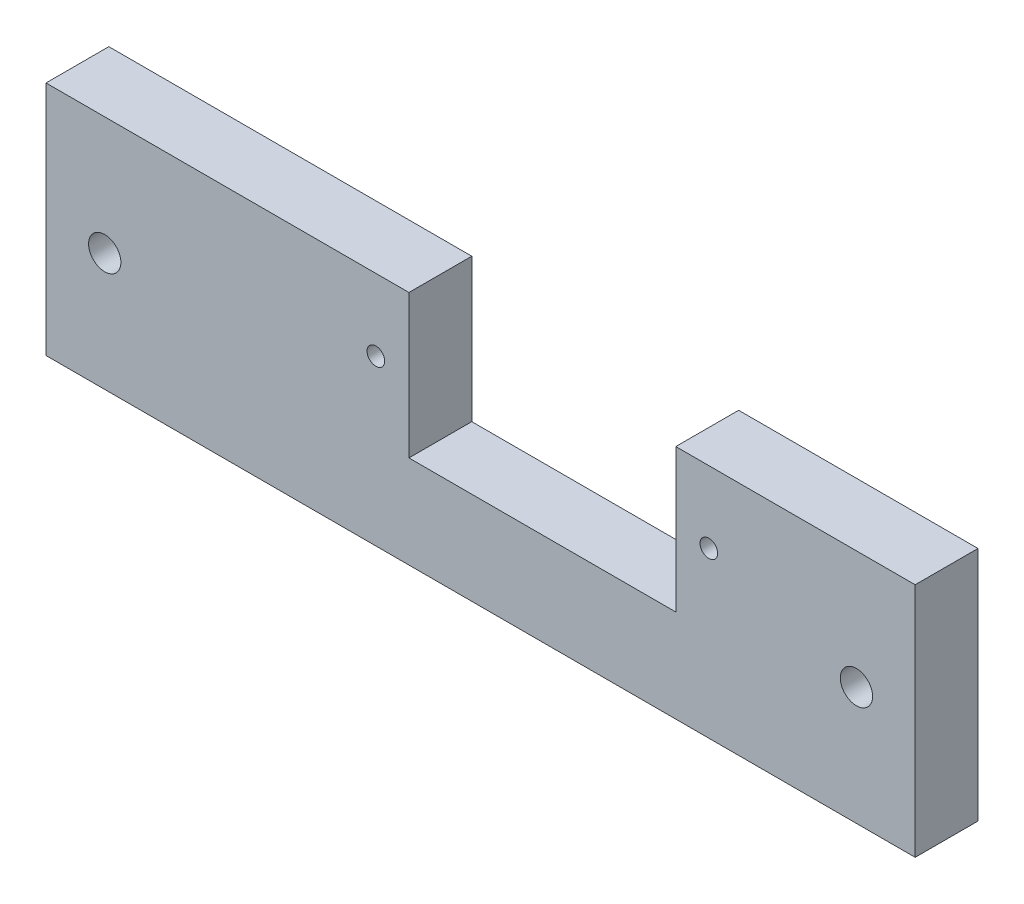
ISO-10303-21;
HEADER;
FILE_DESCRIPTION(('STEP AP214'),'2;1');
FILE_NAME('part.step','',(''),(''),'','','');
FILE_SCHEMA(('AUTOMOTIVE_DESIGN { 1 0 10303 214 1 1 1 1 }'));
ENDSEC;
DATA;
#1=APPLICATION_CONTEXT('core data for automotive mechanical design processes');
#2=APPLICATION_PROTOCOL_DEFINITION('international standard','automotive_design',2000,#1);
#3=PRODUCT_CONTEXT('',#1,'mechanical');
#4=PRODUCT('Part','Part','',(#3));
#5=PRODUCT_RELATED_PRODUCT_CATEGORY('part','',(#4));
#6=PRODUCT_DEFINITION_FORMATION('','',#4);
#7=PRODUCT_DEFINITION_CONTEXT('part definition',#1,'design');
#8=PRODUCT_DEFINITION('design','',#6,#7);
#9=PRODUCT_DEFINITION_SHAPE('','',#8);
#10=(LENGTH_UNIT() NAMED_UNIT(*) SI_UNIT(.MILLI.,.METRE.));
#11=(NAMED_UNIT(*) PLANE_ANGLE_UNIT() SI_UNIT($,.RADIAN.));
#12=(NAMED_UNIT(*) SI_UNIT($,.STERADIAN.) SOLID_ANGLE_UNIT());
#13=UNCERTAINTY_MEASURE_WITH_UNIT(LENGTH_MEASURE(1.E-05),#10,'distance_accuracy_value','');
#14=(GEOMETRIC_REPRESENTATION_CONTEXT(3) GLOBAL_UNCERTAINTY_ASSIGNED_CONTEXT((#13)) GLOBAL_UNIT_ASSIGNED_CONTEXT((#10,
#11,#12)) REPRESENTATION_CONTEXT('',''));
#15=CARTESIAN_POINT('',(0.,0.,0.));
#16=DIRECTION('',(0.,0.,1.));
#17=DIRECTION('',(1.,0.,0.));
#18=AXIS2_PLACEMENT_3D('',#15,#16,#17);
#19=CARTESIAN_POINT('',(0.,20.0999993831,5.35));
#20=DIRECTION('',(0.,1.,0.));
#21=DIRECTION('',(0.,0.,1.));
#22=AXIS2_PLACEMENT_3D('',#19,#20,#21);
#23=PLANE('',#22);
#24=DIRECTION('',(1.,0.,0.));
#25=VECTOR('',#24,1.);
#26=CARTESIAN_POINT('',(0.,20.0999993831,0.));
#27=LINE('',#26,#25);
#28=CARTESIAN_POINT('',(53.6200013011,20.0999993831,0.));
#29=VERTEX_POINT('',#28);
#30=CARTESIAN_POINT('',(74.0000009536,20.0999993831,0.));
#31=VERTEX_POINT('',#30);
#32=EDGE_CURVE('E141',#29,#31,#27,.T.);
#33=ORIENTED_EDGE('',*,*,#32,.F.);
#34=DIRECTION('',(0.,0.,-1.));
#35=VECTOR('',#34,1.);
#36=CARTESIAN_POINT('',(53.6200013011,20.0999993831,5.35));
#37=LINE('',#36,#35);
#38=CARTESIAN_POINT('',(53.6200013011,20.0999993831,5.35));
#39=VERTEX_POINT('',#38);
#40=EDGE_CURVE('E11',#39,#29,#37,.T.);
#41=ORIENTED_EDGE('',*,*,#40,.F.);
#42=DIRECTION('',(1.,0.,0.));
#43=VECTOR('',#42,1.);
#44=CARTESIAN_POINT('',(0.,20.0999993831,5.35));
#45=LINE('',#44,#43);
#46=CARTESIAN_POINT('',(74.0000009536,20.0999993831,5.35));
#47=VERTEX_POINT('',#46);
#48=EDGE_CURVE('E190',#39,#47,#45,.T.);
#49=ORIENTED_EDGE('',*,*,#48,.T.);
#50=DIRECTION('',(0.,0.,-1.));
#51=VECTOR('',#50,1.);
#52=CARTESIAN_POINT('',(74.0000009536,20.0999993831,5.35));
#53=LINE('',#52,#51);
#54=EDGE_CURVE('E52',#47,#31,#53,.T.);
#55=ORIENTED_EDGE('',*,*,#54,.T.);
#56=EDGE_LOOP('',(#33,#41,#49,#55));
#57=FACE_BOUND('',#56,.T.);
#58=ADVANCED_FACE('F35',(#57),#23,.T.);
#59=CARTESIAN_POINT('',(53.6200013011,0.,5.35));
#60=DIRECTION('',(-1.,0.,0.));
#61=DIRECTION('',(0.,0.,1.));
#62=AXIS2_PLACEMENT_3D('',#59,#60,#61);
#63=PLANE('',#62);
#64=DIRECTION('',(0.,1.,0.));
#65=VECTOR('',#64,1.);
#66=CARTESIAN_POINT('',(53.6200013011,0.,0.));
#67=LINE('',#66,#65);
#68=CARTESIAN_POINT('',(53.6200013011,7.8999996185,0.));
#69=VERTEX_POINT('',#68);
#70=EDGE_CURVE('E143',#69,#29,#67,.T.);
#71=ORIENTED_EDGE('',*,*,#70,.F.);
#72=DIRECTION('',(0.,0.,-1.));
#73=VECTOR('',#72,1.);
#74=CARTESIAN_POINT('',(53.6200013011,7.8999996185,5.35));
#75=LINE('',#74,#73);
#76=CARTESIAN_POINT('',(53.6200013011,7.8999996185,5.35));
#77=VERTEX_POINT('',#76);
#78=EDGE_CURVE('E44',#77,#69,#75,.T.);
#79=ORIENTED_EDGE('',*,*,#78,.F.);
#80=DIRECTION('',(0.,1.,0.));
#81=VECTOR('',#80,1.);
#82=CARTESIAN_POINT('',(53.6200013011,0.,5.35));
#83=LINE('',#82,#81);
#84=EDGE_CURVE('E187',#77,#39,#83,.T.);
#85=ORIENTED_EDGE('',*,*,#84,.T.);
#86=ORIENTED_EDGE('',*,*,#40,.T.);
#87=EDGE_LOOP('',(#71,#79,#85,#86));
#88=FACE_BOUND('',#87,.T.);
#89=ADVANCED_FACE('F178',(#88),#63,.T.);
#90=CARTESIAN_POINT('',(0.,7.8999996185,5.35));
#91=DIRECTION('',(0.,1.,0.));
#92=DIRECTION('',(0.,0.,1.));
#93=AXIS2_PLACEMENT_3D('',#90,#91,#92);
#94=PLANE('',#93);
#95=DIRECTION('',(1.,0.,0.));
#96=VECTOR('',#95,1.);
#97=CARTESIAN_POINT('',(0.,7.8999996185,0.));
#98=LINE('',#97,#96);
#99=CARTESIAN_POINT('',(30.9000005945,7.8999996185,0.));
#100=VERTEX_POINT('',#99);
#101=EDGE_CURVE('E146',#100,#69,#98,.T.);
#102=ORIENTED_EDGE('',*,*,#101,.F.);
#103=DIRECTION('',(0.,0.,-1.));
#104=VECTOR('',#103,1.);
#105=CARTESIAN_POINT('',(30.9000005945,7.8999996185,5.35));
#106=LINE('',#105,#104);
#107=CARTESIAN_POINT('',(30.9000005945,7.8999996185,5.35));
#108=VERTEX_POINT('',#107);
#109=EDGE_CURVE('E167',#108,#100,#106,.T.);
#110=ORIENTED_EDGE('',*,*,#109,.F.);
#111=DIRECTION('',(1.,0.,0.));
#112=VECTOR('',#111,1.);
#113=CARTESIAN_POINT('',(0.,7.8999996185,5.35));
#114=LINE('',#113,#112);
#115=EDGE_CURVE('E174',#108,#77,#114,.T.);
#116=ORIENTED_EDGE('',*,*,#115,.T.);
#117=ORIENTED_EDGE('',*,*,#78,.T.);
#118=EDGE_LOOP('',(#102,#110,#116,#117));
#119=FACE_BOUND('',#118,.T.);
#120=ADVANCED_FACE('F172',(#119),#94,.T.);
#121=CARTESIAN_POINT('',(30.9000005945,0.,5.35));
#122=DIRECTION('',(1.,0.,0.));
#123=DIRECTION('',(0.,0.,-1.));
#124=AXIS2_PLACEMENT_3D('',#121,#122,#123);
#125=PLANE('',#124);
#126=DIRECTION('',(0.,-1.,0.));
#127=VECTOR('',#126,1.);
#128=CARTESIAN_POINT('',(30.9000005945,0.,0.));
#129=LINE('',#128,#127);
#130=CARTESIAN_POINT('',(30.9000005945,20.0999993831,0.));
#131=VERTEX_POINT('',#130);
#132=EDGE_CURVE('E149',#131,#100,#129,.T.);
#133=ORIENTED_EDGE('',*,*,#132,.F.);
#134=DIRECTION('',(0.,0.,-1.));
#135=VECTOR('',#134,1.);
#136=CARTESIAN_POINT('',(30.9000005945,20.0999993831,5.35));
#137=LINE('',#136,#135);
#138=CARTESIAN_POINT('',(30.9000005945,20.0999993831,5.35));
#139=VERTEX_POINT('',#138);
#140=EDGE_CURVE('E165',#139,#131,#137,.T.);
#141=ORIENTED_EDGE('',*,*,#140,.F.);
#142=DIRECTION('',(0.,-1.,0.));
#143=VECTOR('',#142,1.);
#144=CARTESIAN_POINT('',(30.9000005945,0.,5.35));
#145=LINE('',#144,#143);
#146=EDGE_CURVE('E186',#139,#108,#145,.T.);
#147=ORIENTED_EDGE('',*,*,#146,.T.);
#148=ORIENTED_EDGE('',*,*,#109,.T.);
#149=EDGE_LOOP('',(#133,#141,#147,#148));
#150=FACE_BOUND('',#149,.T.);
#151=ADVANCED_FACE('F184',(#150),#125,.T.);
#152=CARTESIAN_POINT('',(0.,20.0999993831,5.35));
#153=DIRECTION('',(0.,1.,0.));
#154=DIRECTION('',(0.,0.,1.));
#155=AXIS2_PLACEMENT_3D('',#152,#153,#154);
#156=PLANE('',#155);
#157=DIRECTION('',(1.,0.,0.));
#158=VECTOR('',#157,1.);
#159=CARTESIAN_POINT('',(0.,20.0999993831,0.));
#160=LINE('',#159,#158);
#161=CARTESIAN_POINT('',(0.,20.0999993831,0.));
#162=VERTEX_POINT('',#161);
#163=EDGE_CURVE('E152',#162,#131,#160,.T.);
#164=ORIENTED_EDGE('',*,*,#163,.F.);
#165=DIRECTION('',(0.,0.,-1.));
#166=VECTOR('',#165,1.);
#167=CARTESIAN_POINT('',(0.,20.0999993831,5.35));
#168=LINE('',#167,#166);
#169=CARTESIAN_POINT('',(0.,20.0999993831,5.35));
#170=VERTEX_POINT('',#169);
#171=EDGE_CURVE('E111',#170,#162,#168,.T.);
#172=ORIENTED_EDGE('',*,*,#171,.F.);
#173=DIRECTION('',(1.,0.,0.));
#174=VECTOR('',#173,1.);
#175=CARTESIAN_POINT('',(0.,20.0999993831,5.35));
#176=LINE('',#175,#174);
#177=EDGE_CURVE('E121',#170,#139,#176,.T.);
#178=ORIENTED_EDGE('',*,*,#177,.T.);
#179=ORIENTED_EDGE('',*,*,#140,.T.);
#180=EDGE_LOOP('',(#164,#172,#178,#179));
#181=FACE_BOUND('',#180,.T.);
#182=ADVANCED_FACE('F194',(#181),#156,.T.);
#183=CARTESIAN_POINT('',(0.,0.,5.35));
#184=DIRECTION('',(-1.,0.,0.));
#185=DIRECTION('',(0.,0.,1.));
#186=AXIS2_PLACEMENT_3D('',#183,#184,#185);
#187=PLANE('',#186);
#188=DIRECTION('',(0.,1.,0.));
#189=VECTOR('',#188,1.);
#190=CARTESIAN_POINT('',(0.,0.,0.));
#191=LINE('',#190,#189);
#192=CARTESIAN_POINT('',(0.,0.,0.));
#193=VERTEX_POINT('',#192);
#194=EDGE_CURVE('E107',#193,#162,#191,.T.);
#195=ORIENTED_EDGE('',*,*,#194,.F.);
#196=DIRECTION('',(0.,0.,-1.));
#197=VECTOR('',#196,1.);
#198=CARTESIAN_POINT('',(0.,0.,5.35));
#199=LINE('',#198,#197);
#200=CARTESIAN_POINT('',(0.,0.,5.35));
#201=VERTEX_POINT('',#200);
#202=EDGE_CURVE('E102',#201,#193,#199,.T.);
#203=ORIENTED_EDGE('',*,*,#202,.F.);
#204=DIRECTION('',(0.,1.,0.));
#205=VECTOR('',#204,1.);
#206=CARTESIAN_POINT('',(0.,0.,5.35));
#207=LINE('',#206,#205);
#208=EDGE_CURVE('E105',#201,#170,#207,.T.);
#209=ORIENTED_EDGE('',*,*,#208,.T.);
#210=ORIENTED_EDGE('',*,*,#171,.T.);
#211=EDGE_LOOP('',(#195,#203,#209,#210));
#212=FACE_BOUND('',#211,.T.);
#213=ADVANCED_FACE('F104',(#212),#187,.T.);
#214=CARTESIAN_POINT('',(0.,0.,5.35));
#215=DIRECTION('',(0.,-1.,0.));
#216=DIRECTION('',(0.,0.,-1.));
#217=AXIS2_PLACEMENT_3D('',#214,#215,#216);
#218=PLANE('',#217);
#219=DIRECTION('',(-1.,0.,0.));
#220=VECTOR('',#219,1.);
#221=CARTESIAN_POINT('',(0.,0.,0.));
#222=LINE('',#221,#220);
#223=CARTESIAN_POINT('',(74.0000009536,0.,0.));
#224=VERTEX_POINT('',#223);
#225=EDGE_CURVE('E156',#224,#193,#222,.T.);
#226=ORIENTED_EDGE('',*,*,#225,.F.);
#227=DIRECTION('',(0.,0.,-1.));
#228=VECTOR('',#227,1.);
#229=CARTESIAN_POINT('',(74.0000009536,0.,5.35));
#230=LINE('',#229,#228);
#231=CARTESIAN_POINT('',(74.0000009536,0.,5.35));
#232=VERTEX_POINT('',#231);
#233=EDGE_CURVE('E77',#232,#224,#230,.T.);
#234=ORIENTED_EDGE('',*,*,#233,.F.);
#235=DIRECTION('',(-1.,0.,0.));
#236=VECTOR('',#235,1.);
#237=CARTESIAN_POINT('',(0.,0.,5.35));
#238=LINE('',#237,#236);
#239=EDGE_CURVE('E118',#232,#201,#238,.T.);
#240=ORIENTED_EDGE('',*,*,#239,.T.);
#241=ORIENTED_EDGE('',*,*,#202,.T.);
#242=EDGE_LOOP('',(#226,#234,#240,#241));
#243=FACE_BOUND('',#242,.T.);
#244=ADVANCED_FACE('F123',(#243),#218,.T.);
#245=CARTESIAN_POINT('',(69.0000004768,10.0499996916,5.35));
#246=DIRECTION('',(0.,0.,-1.));
#247=DIRECTION('',(-1.,0.,0.));
#248=AXIS2_PLACEMENT_3D('',#245,#246,#247);
#249=CYLINDRICAL_SURFACE('',#248,1.37499999999999);
#250=CARTESIAN_POINT('',(69.0000004768,10.0499996916,5.35));
#251=DIRECTION('',(0.,0.,1.));
#252=DIRECTION('',(1.,0.,0.));
#253=AXIS2_PLACEMENT_3D('',#250,#251,#252);
#254=CIRCLE('',#253,1.37499999999999);
#255=CARTESIAN_POINT('',(70.3750004768,10.0499996916,5.35));
#256=VERTEX_POINT('',#255);
#257=EDGE_CURVE('E333',#256,#256,#254,.T.);
#258=ORIENTED_EDGE('',*,*,#257,.T.);
#259=EDGE_LOOP('',(#258));
#260=FACE_BOUND('',#259,.T.);
#261=CARTESIAN_POINT('',(69.0000004768,10.0499996916,0.));
#262=DIRECTION('',(0.,0.,1.));
#263=DIRECTION('',(1.,0.,0.));
#264=AXIS2_PLACEMENT_3D('',#261,#262,#263);
#265=CIRCLE('',#264,1.37499999999999);
#266=CARTESIAN_POINT('',(70.3750004768,10.0499996916,0.));
#267=VERTEX_POINT('',#266);
#268=EDGE_CURVE('E138',#267,#267,#265,.T.);
#269=ORIENTED_EDGE('',*,*,#268,.F.);
#270=EDGE_LOOP('',(#269));
#271=FACE_BOUND('',#270,.T.);
#272=ADVANCED_FACE('F216',(#260,#271),#249,.F.);
#273=CARTESIAN_POINT('',(5.00000047679999,10.0499996916,5.35));
#274=DIRECTION('',(0.,0.,-1.));
#275=DIRECTION('',(-1.,0.,0.));
#276=AXIS2_PLACEMENT_3D('',#273,#274,#275);
#277=CYLINDRICAL_SURFACE('',#276,1.375);
#278=CARTESIAN_POINT('',(5.00000047679999,10.0499996916,5.35));
#279=DIRECTION('',(0.,0.,1.));
#280=DIRECTION('',(1.,0.,0.));
#281=AXIS2_PLACEMENT_3D('',#278,#279,#280);
#282=CIRCLE('',#281,1.375);
#283=CARTESIAN_POINT('',(6.37500047679999,10.0499996916,5.35));
#284=VERTEX_POINT('',#283);
#285=EDGE_CURVE('E330',#284,#284,#282,.T.);
#286=ORIENTED_EDGE('',*,*,#285,.T.);
#287=EDGE_LOOP('',(#286));
#288=FACE_BOUND('',#287,.T.);
#289=CARTESIAN_POINT('',(5.00000047679999,10.0499996916,0.));
#290=DIRECTION('',(0.,0.,1.));
#291=DIRECTION('',(1.,0.,0.));
#292=AXIS2_PLACEMENT_3D('',#289,#290,#291);
#293=CIRCLE('',#292,1.375);
#294=CARTESIAN_POINT('',(6.37500047679999,10.0499996916,0.));
#295=VERTEX_POINT('',#294);
#296=EDGE_CURVE('E135',#295,#295,#293,.T.);
#297=ORIENTED_EDGE('',*,*,#296,.F.);
#298=EDGE_LOOP('',(#297));
#299=FACE_BOUND('',#298,.T.);
#300=ADVANCED_FACE('F219',(#288,#299),#277,.F.);
#301=CARTESIAN_POINT('',(56.4336756398,13.9999996915,5.35));
#302=DIRECTION('',(0.,0.,-1.));
#303=DIRECTION('',(-1.,0.,0.));
#304=AXIS2_PLACEMENT_3D('',#301,#302,#303);
#305=CYLINDRICAL_SURFACE('',#304,0.749999999999999);
#306=CARTESIAN_POINT('',(56.4336756398,13.9999996915,5.35));
#307=DIRECTION('',(0.,0.,1.));
#308=DIRECTION('',(1.,0.,0.));
#309=AXIS2_PLACEMENT_3D('',#306,#307,#308);
#310=CIRCLE('',#309,0.749999999999999);
#311=CARTESIAN_POINT('',(57.1836756398,13.9999996915,5.35));
#312=VERTEX_POINT('',#311);
#313=EDGE_CURVE('E230',#312,#312,#310,.T.);
#314=ORIENTED_EDGE('',*,*,#313,.T.);
#315=EDGE_LOOP('',(#314));
#316=FACE_BOUND('',#315,.T.);
#317=CARTESIAN_POINT('',(56.4336756398,13.9999996915,0.));
#318=DIRECTION('',(0.,0.,1.));
#319=DIRECTION('',(1.,0.,0.));
#320=AXIS2_PLACEMENT_3D('',#317,#318,#319);
#321=CIRCLE('',#320,0.749999999999999);
#322=CARTESIAN_POINT('',(57.1836756398,13.9999996915,0.));
#323=VERTEX_POINT('',#322);
#324=EDGE_CURVE('E132',#323,#323,#321,.T.);
#325=ORIENTED_EDGE('',*,*,#324,.F.);
#326=EDGE_LOOP('',(#325));
#327=FACE_BOUND('',#326,.T.);
#328=ADVANCED_FACE('F204',(#316,#327),#305,.F.);
#329=CARTESIAN_POINT('',(28.0863253138,13.9999996915,5.35));
#330=DIRECTION('',(0.,0.,-1.));
#331=DIRECTION('',(-1.,0.,0.));
#332=AXIS2_PLACEMENT_3D('',#329,#330,#331);
#333=CYLINDRICAL_SURFACE('',#332,0.749999999999987);
#334=CARTESIAN_POINT('',(28.0863253138,13.9999996915,5.35));
#335=DIRECTION('',(0.,0.,1.));
#336=DIRECTION('',(1.,0.,0.));
#337=AXIS2_PLACEMENT_3D('',#334,#335,#336);
#338=CIRCLE('',#337,0.749999999999987);
#339=CARTESIAN_POINT('',(28.8363253138,13.9999996915,5.35));
#340=VERTEX_POINT('',#339);
#341=EDGE_CURVE('E161',#340,#340,#338,.T.);
#342=ORIENTED_EDGE('',*,*,#341,.T.);
#343=EDGE_LOOP('',(#342));
#344=FACE_BOUND('',#343,.T.);
#345=CARTESIAN_POINT('',(28.0863253138,13.9999996915,0.));
#346=DIRECTION('',(0.,0.,1.));
#347=DIRECTION('',(1.,0.,0.));
#348=AXIS2_PLACEMENT_3D('',#345,#346,#347);
#349=CIRCLE('',#348,0.749999999999987);
#350=CARTESIAN_POINT('',(28.8363253138,13.9999996915,0.));
#351=VERTEX_POINT('',#350);
#352=EDGE_CURVE('E129',#351,#351,#349,.T.);
#353=ORIENTED_EDGE('',*,*,#352,.F.);
#354=EDGE_LOOP('',(#353));
#355=FACE_BOUND('',#354,.T.);
#356=ADVANCED_FACE('F37',(#344,#355),#333,.F.);
#357=CARTESIAN_POINT('',(74.0000009536,0.,5.35));
#358=DIRECTION('',(1.,0.,0.));
#359=DIRECTION('',(0.,0.,-1.));
#360=AXIS2_PLACEMENT_3D('',#357,#358,#359);
#361=PLANE('',#360);
#362=DIRECTION('',(0.,-1.,0.));
#363=VECTOR('',#362,1.);
#364=CARTESIAN_POINT('',(74.0000009536,0.,0.));
#365=LINE('',#364,#363);
#366=EDGE_CURVE('E158',#31,#224,#365,.T.);
#367=ORIENTED_EDGE('',*,*,#366,.F.);
#368=ORIENTED_EDGE('',*,*,#54,.F.);
#369=DIRECTION('',(0.,-1.,0.));
#370=VECTOR('',#369,1.);
#371=CARTESIAN_POINT('',(74.0000009536,0.,5.35));
#372=LINE('',#371,#370);
#373=EDGE_CURVE('E124',#47,#232,#372,.T.);
#374=ORIENTED_EDGE('',*,*,#373,.T.);
#375=ORIENTED_EDGE('',*,*,#233,.T.);
#376=EDGE_LOOP('',(#367,#368,#374,#375));
#377=FACE_BOUND('',#376,.T.);
#378=ADVANCED_FACE('F195',(#377),#361,.T.);
#379=CARTESIAN_POINT('',(0.,0.,5.35));
#380=DIRECTION('',(0.,0.,1.));
#381=DIRECTION('',(1.,0.,0.));
#382=AXIS2_PLACEMENT_3D('',#379,#380,#381);
#383=PLANE('',#382);
#384=ORIENTED_EDGE('',*,*,#341,.F.);
#385=EDGE_LOOP('',(#384));
#386=FACE_BOUND('',#385,.T.);
#387=ORIENTED_EDGE('',*,*,#313,.F.);
#388=EDGE_LOOP('',(#387));
#389=FACE_BOUND('',#388,.T.);
#390=ORIENTED_EDGE('',*,*,#285,.F.);
#391=EDGE_LOOP('',(#390));
#392=FACE_BOUND('',#391,.T.);
#393=ORIENTED_EDGE('',*,*,#257,.F.);
#394=EDGE_LOOP('',(#393));
#395=FACE_BOUND('',#394,.T.);
#396=ORIENTED_EDGE('',*,*,#48,.F.);
#397=ORIENTED_EDGE('',*,*,#84,.F.);
#398=ORIENTED_EDGE('',*,*,#115,.F.);
#399=ORIENTED_EDGE('',*,*,#146,.F.);
#400=ORIENTED_EDGE('',*,*,#177,.F.);
#401=ORIENTED_EDGE('',*,*,#208,.F.);
#402=ORIENTED_EDGE('',*,*,#239,.F.);
#403=ORIENTED_EDGE('',*,*,#373,.F.);
#404=EDGE_LOOP('',(#396,#397,#398,#399,#400,#401,#402,#403));
#405=FACE_BOUND('',#404,.T.);
#406=ADVANCED_FACE('F116',(#386,#389,#392,#395,#405),#383,.T.);
#407=CARTESIAN_POINT('',(0.,0.,0.));
#408=DIRECTION('',(0.,0.,1.));
#409=DIRECTION('',(1.,0.,0.));
#410=AXIS2_PLACEMENT_3D('',#407,#408,#409);
#411=PLANE('',#410);
#412=ORIENTED_EDGE('',*,*,#352,.T.);
#413=EDGE_LOOP('',(#412));
#414=FACE_BOUND('',#413,.T.);
#415=ORIENTED_EDGE('',*,*,#324,.T.);
#416=EDGE_LOOP('',(#415));
#417=FACE_BOUND('',#416,.T.);
#418=ORIENTED_EDGE('',*,*,#296,.T.);
#419=EDGE_LOOP('',(#418));
#420=FACE_BOUND('',#419,.T.);
#421=ORIENTED_EDGE('',*,*,#268,.T.);
#422=EDGE_LOOP('',(#421));
#423=FACE_BOUND('',#422,.T.);
#424=ORIENTED_EDGE('',*,*,#32,.T.);
#425=ORIENTED_EDGE('',*,*,#366,.T.);
#426=ORIENTED_EDGE('',*,*,#225,.T.);
#427=ORIENTED_EDGE('',*,*,#194,.T.);
#428=ORIENTED_EDGE('',*,*,#163,.T.);
#429=ORIENTED_EDGE('',*,*,#132,.T.);
#430=ORIENTED_EDGE('',*,*,#101,.T.);
#431=ORIENTED_EDGE('',*,*,#70,.T.);
#432=EDGE_LOOP('',(#424,#425,#426,#427,#428,#429,#430,#431));
#433=FACE_BOUND('',#432,.T.);
#434=ADVANCED_FACE('F180',(#414,#417,#420,#423,#433),#411,.F.);
#435=CLOSED_SHELL('',(#58,#89,#120,#151,#182,#213,#244,#272,#300,#328,#356,#378,#406,#434));
#436=MANIFOLD_SOLID_BREP('B2',#435);
#437=ADVANCED_BREP_SHAPE_REPRESENTATION('',(#18,#436),#14);
#438=SHAPE_DEFINITION_REPRESENTATION(#9,#437);
ENDSEC;
END-ISO-10303-21;
